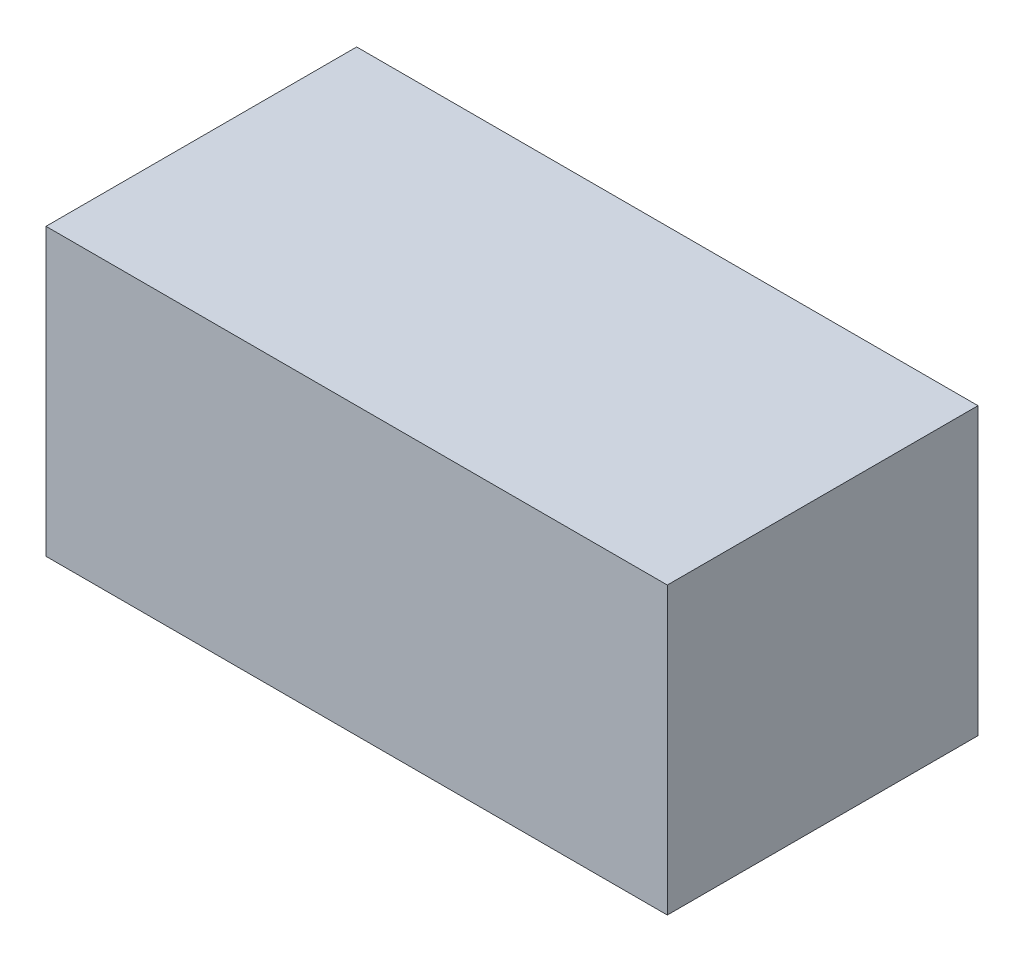
ISO-10303-21;
HEADER;
FILE_DESCRIPTION(('STEP AP214'),'2;1');
FILE_NAME('part.step','',(''),(''),'','','');
FILE_SCHEMA(('AUTOMOTIVE_DESIGN { 1 0 10303 214 1 1 1 1 }'));
ENDSEC;
DATA;
#1=APPLICATION_CONTEXT('core data for automotive mechanical design processes');
#2=APPLICATION_PROTOCOL_DEFINITION('international standard','automotive_design',2000,#1);
#3=PRODUCT_CONTEXT('',#1,'mechanical');
#4=PRODUCT('Part','Part','',(#3));
#5=PRODUCT_RELATED_PRODUCT_CATEGORY('part','',(#4));
#6=PRODUCT_DEFINITION_FORMATION('','',#4);
#7=PRODUCT_DEFINITION_CONTEXT('part definition',#1,'design');
#8=PRODUCT_DEFINITION('design','',#6,#7);
#9=PRODUCT_DEFINITION_SHAPE('','',#8);
#10=(LENGTH_UNIT() NAMED_UNIT(*) SI_UNIT(.MILLI.,.METRE.));
#11=(NAMED_UNIT(*) PLANE_ANGLE_UNIT() SI_UNIT($,.RADIAN.));
#12=(NAMED_UNIT(*) SI_UNIT($,.STERADIAN.) SOLID_ANGLE_UNIT());
#13=UNCERTAINTY_MEASURE_WITH_UNIT(LENGTH_MEASURE(1.E-05),#10,'distance_accuracy_value','');
#14=(GEOMETRIC_REPRESENTATION_CONTEXT(3) GLOBAL_UNCERTAINTY_ASSIGNED_CONTEXT((#13)) GLOBAL_UNIT_ASSIGNED_CONTEXT((#10,
#11,#12)) REPRESENTATION_CONTEXT('',''));
#15=CARTESIAN_POINT('',(0.,0.,0.));
#16=DIRECTION('',(0.,0.,1.));
#17=DIRECTION('',(1.,0.,0.));
#18=AXIS2_PLACEMENT_3D('',#15,#16,#17);
#19=CARTESIAN_POINT('',(25.,23.,-12.5));
#20=DIRECTION('',(-1.,0.,0.));
#21=DIRECTION('',(0.,0.,1.));
#22=AXIS2_PLACEMENT_3D('',#19,#20,#21);
#23=PLANE('',#22);
#24=DIRECTION('',(0.,0.,-1.));
#25=VECTOR('',#24,1.);
#26=CARTESIAN_POINT('',(25.,0.,-12.5));
#27=LINE('',#26,#25);
#28=CARTESIAN_POINT('',(25.,0.,12.5));
#29=VERTEX_POINT('',#28);
#30=CARTESIAN_POINT('',(25.,0.,-12.5));
#31=VERTEX_POINT('',#30);
#32=EDGE_CURVE('E102',#29,#31,#27,.T.);
#33=ORIENTED_EDGE('',*,*,#32,.T.);
#34=DIRECTION('',(0.,-1.,0.));
#35=VECTOR('',#34,1.);
#36=CARTESIAN_POINT('',(25.,23.,-12.5));
#37=LINE('',#36,#35);
#38=CARTESIAN_POINT('',(25.,23.,-12.5));
#39=VERTEX_POINT('',#38);
#40=EDGE_CURVE('E11',#39,#31,#37,.T.);
#41=ORIENTED_EDGE('',*,*,#40,.F.);
#42=DIRECTION('',(0.,0.,-1.));
#43=VECTOR('',#42,1.);
#44=CARTESIAN_POINT('',(25.,23.,-12.5));
#45=LINE('',#44,#43);
#46=CARTESIAN_POINT('',(25.,23.,12.5));
#47=VERTEX_POINT('',#46);
#48=EDGE_CURVE('E90',#47,#39,#45,.T.);
#49=ORIENTED_EDGE('',*,*,#48,.F.);
#50=DIRECTION('',(0.,-1.,0.));
#51=VECTOR('',#50,1.);
#52=CARTESIAN_POINT('',(25.,23.,12.5));
#53=LINE('',#52,#51);
#54=EDGE_CURVE('E98',#47,#29,#53,.T.);
#55=ORIENTED_EDGE('',*,*,#54,.T.);
#56=EDGE_LOOP('',(#33,#41,#49,#55));
#57=FACE_BOUND('',#56,.T.);
#58=ADVANCED_FACE('F39',(#57),#23,.F.);
#59=CARTESIAN_POINT('',(-25.,23.,-12.5));
#60=DIRECTION('',(0.,0.,1.));
#61=DIRECTION('',(1.,0.,0.));
#62=AXIS2_PLACEMENT_3D('',#59,#60,#61);
#63=PLANE('',#62);
#64=DIRECTION('',(-1.,0.,0.));
#65=VECTOR('',#64,1.);
#66=CARTESIAN_POINT('',(-25.,0.,-12.5));
#67=LINE('',#66,#65);
#68=CARTESIAN_POINT('',(-25.,0.,-12.5));
#69=VERTEX_POINT('',#68);
#70=EDGE_CURVE('E94',#31,#69,#67,.T.);
#71=ORIENTED_EDGE('',*,*,#70,.T.);
#72=DIRECTION('',(0.,-1.,0.));
#73=VECTOR('',#72,1.);
#74=CARTESIAN_POINT('',(-25.,23.,-12.5));
#75=LINE('',#74,#73);
#76=CARTESIAN_POINT('',(-25.,23.,-12.5));
#77=VERTEX_POINT('',#76);
#78=EDGE_CURVE('E47',#77,#69,#75,.T.);
#79=ORIENTED_EDGE('',*,*,#78,.F.);
#80=DIRECTION('',(-1.,0.,0.));
#81=VECTOR('',#80,1.);
#82=CARTESIAN_POINT('',(-25.,23.,-12.5));
#83=LINE('',#82,#81);
#84=EDGE_CURVE('E85',#39,#77,#83,.T.);
#85=ORIENTED_EDGE('',*,*,#84,.F.);
#86=ORIENTED_EDGE('',*,*,#40,.T.);
#87=EDGE_LOOP('',(#71,#79,#85,#86));
#88=FACE_BOUND('',#87,.T.);
#89=ADVANCED_FACE('F93',(#88),#63,.F.);
#90=CARTESIAN_POINT('',(-25.,23.,-12.5));
#91=DIRECTION('',(1.,0.,0.));
#92=DIRECTION('',(0.,0.,-1.));
#93=AXIS2_PLACEMENT_3D('',#90,#91,#92);
#94=PLANE('',#93);
#95=DIRECTION('',(0.,0.,1.));
#96=VECTOR('',#95,1.);
#97=CARTESIAN_POINT('',(-25.,0.,-12.5));
#98=LINE('',#97,#96);
#99=CARTESIAN_POINT('',(-25.,0.,12.5));
#100=VERTEX_POINT('',#99);
#101=EDGE_CURVE('E72',#69,#100,#98,.T.);
#102=ORIENTED_EDGE('',*,*,#101,.T.);
#103=DIRECTION('',(0.,-1.,0.));
#104=VECTOR('',#103,1.);
#105=CARTESIAN_POINT('',(-25.,23.,12.5));
#106=LINE('',#105,#104);
#107=CARTESIAN_POINT('',(-25.,23.,12.5));
#108=VERTEX_POINT('',#107);
#109=EDGE_CURVE('E95',#108,#100,#106,.T.);
#110=ORIENTED_EDGE('',*,*,#109,.F.);
#111=DIRECTION('',(0.,0.,1.));
#112=VECTOR('',#111,1.);
#113=CARTESIAN_POINT('',(-25.,23.,-12.5));
#114=LINE('',#113,#112);
#115=EDGE_CURVE('E88',#77,#108,#114,.T.);
#116=ORIENTED_EDGE('',*,*,#115,.F.);
#117=ORIENTED_EDGE('',*,*,#78,.T.);
#118=EDGE_LOOP('',(#102,#110,#116,#117));
#119=FACE_BOUND('',#118,.T.);
#120=ADVANCED_FACE('F96',(#119),#94,.F.);
#121=CARTESIAN_POINT('',(-25.,23.,12.5));
#122=DIRECTION('',(0.,0.,-1.));
#123=DIRECTION('',(-1.,0.,0.));
#124=AXIS2_PLACEMENT_3D('',#121,#122,#123);
#125=PLANE('',#124);
#126=DIRECTION('',(1.,0.,0.));
#127=VECTOR('',#126,1.);
#128=CARTESIAN_POINT('',(-25.,0.,12.5));
#129=LINE('',#128,#127);
#130=EDGE_CURVE('E78',#100,#29,#129,.T.);
#131=ORIENTED_EDGE('',*,*,#130,.T.);
#132=ORIENTED_EDGE('',*,*,#54,.F.);
#133=DIRECTION('',(1.,0.,0.));
#134=VECTOR('',#133,1.);
#135=CARTESIAN_POINT('',(-25.,23.,12.5));
#136=LINE('',#135,#134);
#137=EDGE_CURVE('E55',#108,#47,#136,.T.);
#138=ORIENTED_EDGE('',*,*,#137,.F.);
#139=ORIENTED_EDGE('',*,*,#109,.T.);
#140=EDGE_LOOP('',(#131,#132,#138,#139));
#141=FACE_BOUND('',#140,.T.);
#142=ADVANCED_FACE('F109',(#141),#125,.F.);
#143=CARTESIAN_POINT('',(0.,23.,0.));
#144=DIRECTION('',(0.,1.,0.));
#145=DIRECTION('',(0.,0.,1.));
#146=AXIS2_PLACEMENT_3D('',#143,#144,#145);
#147=PLANE('',#146);
#148=ORIENTED_EDGE('',*,*,#48,.T.);
#149=ORIENTED_EDGE('',*,*,#84,.T.);
#150=ORIENTED_EDGE('',*,*,#115,.T.);
#151=ORIENTED_EDGE('',*,*,#137,.T.);
#152=EDGE_LOOP('',(#148,#149,#150,#151));
#153=FACE_BOUND('',#152,.T.);
#154=ADVANCED_FACE('F86',(#153),#147,.T.);
#155=CARTESIAN_POINT('',(0.,0.,0.));
#156=DIRECTION('',(0.,1.,0.));
#157=DIRECTION('',(0.,0.,1.));
#158=AXIS2_PLACEMENT_3D('',#155,#156,#157);
#159=PLANE('',#158);
#160=ORIENTED_EDGE('',*,*,#32,.F.);
#161=ORIENTED_EDGE('',*,*,#130,.F.);
#162=ORIENTED_EDGE('',*,*,#101,.F.);
#163=ORIENTED_EDGE('',*,*,#70,.F.);
#164=EDGE_LOOP('',(#160,#161,#162,#163));
#165=FACE_BOUND('',#164,.T.);
#166=ADVANCED_FACE('F112',(#165),#159,.F.);
#167=CLOSED_SHELL('',(#58,#89,#120,#142,#154,#166));
#168=MANIFOLD_SOLID_BREP('B2',#167);
#169=ADVANCED_BREP_SHAPE_REPRESENTATION('',(#18,#168),#14);
#170=SHAPE_DEFINITION_REPRESENTATION(#9,#169);
ENDSEC;
END-ISO-10303-21;
